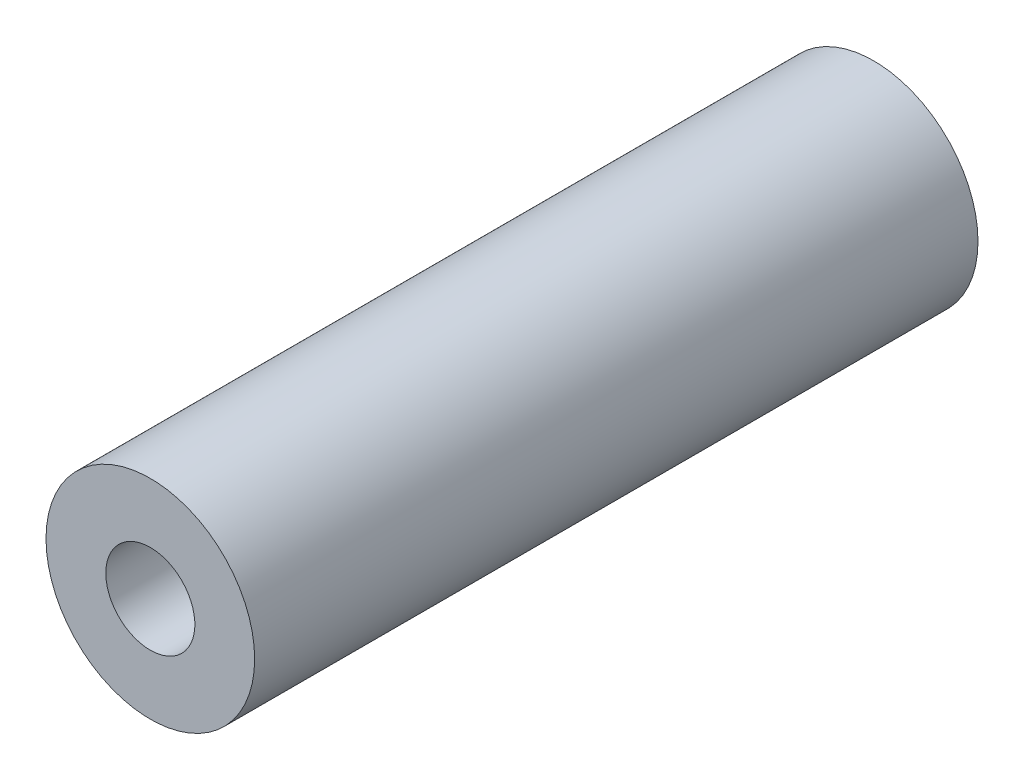
ISO-10303-21;
HEADER;
FILE_DESCRIPTION(('STEP AP214'),'2;1');
FILE_NAME('part.step','',(''),(''),'','','');
FILE_SCHEMA(('AUTOMOTIVE_DESIGN { 1 0 10303 214 1 1 1 1 }'));
ENDSEC;
DATA;
#1=APPLICATION_CONTEXT('core data for automotive mechanical design processes');
#2=APPLICATION_PROTOCOL_DEFINITION('international standard','automotive_design',2000,#1);
#3=PRODUCT_CONTEXT('',#1,'mechanical');
#4=PRODUCT('Part','Part','',(#3));
#5=PRODUCT_RELATED_PRODUCT_CATEGORY('part','',(#4));
#6=PRODUCT_DEFINITION_FORMATION('','',#4);
#7=PRODUCT_DEFINITION_CONTEXT('part definition',#1,'design');
#8=PRODUCT_DEFINITION('design','',#6,#7);
#9=PRODUCT_DEFINITION_SHAPE('','',#8);
#10=(LENGTH_UNIT() NAMED_UNIT(*) SI_UNIT(.MILLI.,.METRE.));
#11=(NAMED_UNIT(*) PLANE_ANGLE_UNIT() SI_UNIT($,.RADIAN.));
#12=(NAMED_UNIT(*) SI_UNIT($,.STERADIAN.) SOLID_ANGLE_UNIT());
#13=UNCERTAINTY_MEASURE_WITH_UNIT(LENGTH_MEASURE(1.E-05),#10,'distance_accuracy_value','');
#14=(GEOMETRIC_REPRESENTATION_CONTEXT(3) GLOBAL_UNCERTAINTY_ASSIGNED_CONTEXT((#13)) GLOBAL_UNIT_ASSIGNED_CONTEXT((#10,
#11,#12)) REPRESENTATION_CONTEXT('',''));
#15=CARTESIAN_POINT('',(0.,0.,0.));
#16=DIRECTION('',(0.,0.,1.));
#17=DIRECTION('',(1.,0.,0.));
#18=AXIS2_PLACEMENT_3D('',#15,#16,#17);
#19=CARTESIAN_POINT('',(0.,0.,26.));
#20=DIRECTION('',(0.,0.,1.));
#21=DIRECTION('',(1.,0.,0.));
#22=AXIS2_PLACEMENT_3D('',#19,#20,#21);
#23=PLANE('',#22);
#24=CARTESIAN_POINT('',(0.,0.,26.));
#25=DIRECTION('',(0.,0.,1.));
#26=DIRECTION('',(1.,0.,0.));
#27=AXIS2_PLACEMENT_3D('',#24,#25,#26);
#28=CIRCLE('',#27,3.75);
#29=CARTESIAN_POINT('',(-3.75,0.,26.));
#30=VERTEX_POINT('',#29);
#31=EDGE_CURVE('E11',#30,#30,#28,.T.);
#32=ORIENTED_EDGE('',*,*,#31,.T.);
#33=EDGE_LOOP('',(#32));
#34=FACE_BOUND('',#33,.T.);
#35=CARTESIAN_POINT('',(0.,0.,26.));
#36=DIRECTION('',(0.,0.,1.));
#37=DIRECTION('',(1.,0.,0.));
#38=AXIS2_PLACEMENT_3D('',#35,#36,#37);
#39=CIRCLE('',#38,1.6);
#40=CARTESIAN_POINT('',(-1.6,0.,26.));
#41=VERTEX_POINT('',#40);
#42=EDGE_CURVE('E48',#41,#41,#39,.T.);
#43=ORIENTED_EDGE('',*,*,#42,.F.);
#44=EDGE_LOOP('',(#43));
#45=FACE_BOUND('',#44,.T.);
#46=ADVANCED_FACE('F37',(#34,#45),#23,.T.);
#47=CARTESIAN_POINT('',(0.,0.,0.));
#48=DIRECTION('',(0.,0.,1.));
#49=DIRECTION('',(1.,0.,0.));
#50=AXIS2_PLACEMENT_3D('',#47,#48,#49);
#51=PLANE('',#50);
#52=CARTESIAN_POINT('',(0.,0.,0.));
#53=DIRECTION('',(0.,0.,1.));
#54=DIRECTION('',(1.,0.,0.));
#55=AXIS2_PLACEMENT_3D('',#52,#53,#54);
#56=CIRCLE('',#55,3.75);
#57=CARTESIAN_POINT('',(-3.75,0.,0.));
#58=VERTEX_POINT('',#57);
#59=EDGE_CURVE('E41',#58,#58,#56,.T.);
#60=ORIENTED_EDGE('',*,*,#59,.F.);
#61=EDGE_LOOP('',(#60));
#62=FACE_BOUND('',#61,.T.);
#63=CARTESIAN_POINT('',(0.,0.,0.));
#64=DIRECTION('',(0.,0.,1.));
#65=DIRECTION('',(1.,0.,0.));
#66=AXIS2_PLACEMENT_3D('',#63,#64,#65);
#67=CIRCLE('',#66,1.6);
#68=CARTESIAN_POINT('',(-1.6,0.,0.));
#69=VERTEX_POINT('',#68);
#70=EDGE_CURVE('E50',#69,#69,#67,.T.);
#71=ORIENTED_EDGE('',*,*,#70,.T.);
#72=EDGE_LOOP('',(#71));
#73=FACE_BOUND('',#72,.T.);
#74=ADVANCED_FACE('F60',(#62,#73),#51,.F.);
#75=CARTESIAN_POINT('',(0.,0.,26.));
#76=DIRECTION('',(0.,0.,-1.));
#77=DIRECTION('',(-1.,0.,0.));
#78=AXIS2_PLACEMENT_3D('',#75,#76,#77);
#79=CYLINDRICAL_SURFACE('',#78,3.75);
#80=CARTESIAN_POINT('',(-3.75,0.,26.));
#81=CARTESIAN_POINT('',(-3.75,0.,25.7291666666667));
#82=CARTESIAN_POINT('',(-3.75,0.,25.4583333333333));
#83=CARTESIAN_POINT('',(-3.75,0.,24.9166666666667));
#84=CARTESIAN_POINT('',(-3.75,0.,24.6458333333333));
#85=CARTESIAN_POINT('',(-3.75,0.,24.1041666666667));
#86=CARTESIAN_POINT('',(-3.75,0.,23.8333333333333));
#87=CARTESIAN_POINT('',(-3.75,0.,23.2916666666667));
#88=CARTESIAN_POINT('',(-3.75,0.,23.0208333333333));
#89=CARTESIAN_POINT('',(-3.75,0.,22.4791666666667));
#90=CARTESIAN_POINT('',(-3.75,0.,22.2083333333333));
#91=CARTESIAN_POINT('',(-3.75,0.,21.6666666666667));
#92=CARTESIAN_POINT('',(-3.75,0.,21.3958333333333));
#93=CARTESIAN_POINT('',(-3.75,0.,20.8541666666667));
#94=CARTESIAN_POINT('',(-3.75,0.,20.5833333333333));
#95=CARTESIAN_POINT('',(-3.75,0.,20.0416666666667));
#96=CARTESIAN_POINT('',(-3.75,0.,19.7708333333333));
#97=CARTESIAN_POINT('',(-3.75,0.,19.2291666666667));
#98=CARTESIAN_POINT('',(-3.75,0.,18.9583333333333));
#99=CARTESIAN_POINT('',(-3.75,0.,18.4166666666667));
#100=CARTESIAN_POINT('',(-3.75,0.,18.1458333333333));
#101=CARTESIAN_POINT('',(-3.75,0.,17.6041666666667));
#102=CARTESIAN_POINT('',(-3.75,0.,17.3333333333333));
#103=CARTESIAN_POINT('',(-3.75,0.,16.7916666666667));
#104=CARTESIAN_POINT('',(-3.75,0.,16.5208333333333));
#105=CARTESIAN_POINT('',(-3.75,0.,15.9791666666667));
#106=CARTESIAN_POINT('',(-3.75,0.,15.7083333333333));
#107=CARTESIAN_POINT('',(-3.75,0.,15.1666666666667));
#108=CARTESIAN_POINT('',(-3.75,0.,14.8958333333333));
#109=CARTESIAN_POINT('',(-3.75,0.,14.3541666666667));
#110=CARTESIAN_POINT('',(-3.75,0.,14.0833333333333));
#111=CARTESIAN_POINT('',(-3.75,0.,13.5416666666667));
#112=CARTESIAN_POINT('',(-3.75,0.,13.2708333333333));
#113=CARTESIAN_POINT('',(-3.75,0.,12.7291666666667));
#114=CARTESIAN_POINT('',(-3.75,0.,12.4583333333333));
#115=CARTESIAN_POINT('',(-3.75,0.,11.9166666666667));
#116=CARTESIAN_POINT('',(-3.75,0.,11.6458333333333));
#117=CARTESIAN_POINT('',(-3.75,0.,11.1041666666667));
#118=CARTESIAN_POINT('',(-3.75,0.,10.8333333333333));
#119=CARTESIAN_POINT('',(-3.75,0.,10.2916666666667));
#120=CARTESIAN_POINT('',(-3.75,0.,10.0208333333333));
#121=CARTESIAN_POINT('',(-3.75,0.,9.47916666666667));
#122=CARTESIAN_POINT('',(-3.75,0.,9.20833333333333));
#123=CARTESIAN_POINT('',(-3.75,0.,8.66666666666667));
#124=CARTESIAN_POINT('',(-3.75,0.,8.39583333333333));
#125=CARTESIAN_POINT('',(-3.75,0.,7.85416666666667));
#126=CARTESIAN_POINT('',(-3.75,0.,7.58333333333333));
#127=CARTESIAN_POINT('',(-3.75,0.,7.04166666666667));
#128=CARTESIAN_POINT('',(-3.75,0.,6.77083333333333));
#129=CARTESIAN_POINT('',(-3.75,0.,6.22916666666667));
#130=CARTESIAN_POINT('',(-3.75,0.,5.95833333333333));
#131=CARTESIAN_POINT('',(-3.75,0.,5.41666666666667));
#132=CARTESIAN_POINT('',(-3.75,0.,5.14583333333333));
#133=CARTESIAN_POINT('',(-3.75,0.,4.60416666666667));
#134=CARTESIAN_POINT('',(-3.75,0.,4.33333333333333));
#135=CARTESIAN_POINT('',(-3.75,0.,3.79166666666667));
#136=CARTESIAN_POINT('',(-3.75,0.,3.52083333333333));
#137=CARTESIAN_POINT('',(-3.75,0.,2.97916666666667));
#138=CARTESIAN_POINT('',(-3.75,0.,2.70833333333333));
#139=CARTESIAN_POINT('',(-3.75,0.,2.16666666666667));
#140=CARTESIAN_POINT('',(-3.75,0.,1.89583333333333));
#141=CARTESIAN_POINT('',(-3.75,0.,1.35416666666667));
#142=CARTESIAN_POINT('',(-3.75,0.,1.08333333333333));
#143=CARTESIAN_POINT('',(-3.75,0.,0.541666666666667));
#144=CARTESIAN_POINT('',(-3.75,0.,0.270833333333334));
#145=CARTESIAN_POINT('',(-3.75,0.,0.));
#146=B_SPLINE_CURVE_WITH_KNOTS('',3,(#80,#81,#82,#83,#84,#85,#86,#87,#88,#89,#90,#91,#92,#93,
#94,#95,#96,#97,#98,#99,#100,#101,#102,#103,#104,#105,#106,#107,#108,#109,#110,#111,#112,#113,
#114,#115,#116,#117,#118,#119,#120,#121,#122,#123,#124,#125,#126,#127,#128,#129,#130,#131,#132,
#133,#134,#135,#136,#137,#138,#139,#140,#141,#142,#143,#144,#145),.UNSPECIFIED.,.F.,.F.,(4,2,2,
2,2,2,2,2,2,2,2,2,2,2,2,2,2,2,2,2,2,2,2,2,2,2,2,2,2,2,2,2,4),(0.,0.812500000000001,1.625,2.4375,
3.25,4.0625,4.875,5.6875,6.5,7.3125,8.125,8.9375,9.75,10.5625,11.375,12.1875,13.,13.8125,14.625,
15.4375,16.25,17.0625,17.875,18.6875,19.5,20.3125,21.125,21.9375,22.75,23.5625,24.375,25.1875,
26.),.UNSPECIFIED.);
#147=EDGE_CURVE('BSEAM39',#30,#58,#146,.T.);
#148=ORIENTED_EDGE('',*,*,#31,.F.);
#149=ORIENTED_EDGE('',*,*,#59,.T.);
#150=ORIENTED_EDGE('',*,*,#147,.T.);
#151=ORIENTED_EDGE('',*,*,#147,.F.);
#152=EDGE_LOOP('',(#148,#150,#149,#151));
#153=FACE_BOUND('',#152,.T.);
#154=ADVANCED_FACE('F39',(#153),#79,.T.);
#155=CARTESIAN_POINT('',(0.,0.,26.));
#156=DIRECTION('',(0.,0.,-1.));
#157=DIRECTION('',(-1.,0.,0.));
#158=AXIS2_PLACEMENT_3D('',#155,#156,#157);
#159=CYLINDRICAL_SURFACE('',#158,1.6);
#160=CARTESIAN_POINT('',(-1.6,0.,26.));
#161=CARTESIAN_POINT('',(-1.6,0.,25.7291666666667));
#162=CARTESIAN_POINT('',(-1.6,0.,25.4583333333333));
#163=CARTESIAN_POINT('',(-1.6,0.,24.9166666666667));
#164=CARTESIAN_POINT('',(-1.6,0.,24.6458333333333));
#165=CARTESIAN_POINT('',(-1.6,0.,24.1041666666667));
#166=CARTESIAN_POINT('',(-1.6,0.,23.8333333333333));
#167=CARTESIAN_POINT('',(-1.6,0.,23.2916666666667));
#168=CARTESIAN_POINT('',(-1.6,0.,23.0208333333333));
#169=CARTESIAN_POINT('',(-1.6,0.,22.4791666666667));
#170=CARTESIAN_POINT('',(-1.6,0.,22.2083333333333));
#171=CARTESIAN_POINT('',(-1.6,0.,21.6666666666667));
#172=CARTESIAN_POINT('',(-1.6,0.,21.3958333333333));
#173=CARTESIAN_POINT('',(-1.6,0.,20.8541666666667));
#174=CARTESIAN_POINT('',(-1.6,0.,20.5833333333333));
#175=CARTESIAN_POINT('',(-1.6,0.,20.0416666666667));
#176=CARTESIAN_POINT('',(-1.6,0.,19.7708333333333));
#177=CARTESIAN_POINT('',(-1.6,0.,19.2291666666667));
#178=CARTESIAN_POINT('',(-1.6,0.,18.9583333333333));
#179=CARTESIAN_POINT('',(-1.6,0.,18.4166666666667));
#180=CARTESIAN_POINT('',(-1.6,0.,18.1458333333333));
#181=CARTESIAN_POINT('',(-1.6,0.,17.6041666666667));
#182=CARTESIAN_POINT('',(-1.6,0.,17.3333333333333));
#183=CARTESIAN_POINT('',(-1.6,0.,16.7916666666667));
#184=CARTESIAN_POINT('',(-1.6,0.,16.5208333333333));
#185=CARTESIAN_POINT('',(-1.6,0.,15.9791666666667));
#186=CARTESIAN_POINT('',(-1.6,0.,15.7083333333333));
#187=CARTESIAN_POINT('',(-1.6,0.,15.1666666666667));
#188=CARTESIAN_POINT('',(-1.6,0.,14.8958333333333));
#189=CARTESIAN_POINT('',(-1.6,0.,14.3541666666667));
#190=CARTESIAN_POINT('',(-1.6,0.,14.0833333333333));
#191=CARTESIAN_POINT('',(-1.6,0.,13.5416666666667));
#192=CARTESIAN_POINT('',(-1.6,0.,13.2708333333333));
#193=CARTESIAN_POINT('',(-1.6,0.,12.7291666666667));
#194=CARTESIAN_POINT('',(-1.6,0.,12.4583333333333));
#195=CARTESIAN_POINT('',(-1.6,0.,11.9166666666667));
#196=CARTESIAN_POINT('',(-1.6,0.,11.6458333333333));
#197=CARTESIAN_POINT('',(-1.6,0.,11.1041666666667));
#198=CARTESIAN_POINT('',(-1.6,0.,10.8333333333333));
#199=CARTESIAN_POINT('',(-1.6,0.,10.2916666666667));
#200=CARTESIAN_POINT('',(-1.6,0.,10.0208333333333));
#201=CARTESIAN_POINT('',(-1.6,0.,9.47916666666667));
#202=CARTESIAN_POINT('',(-1.6,0.,9.20833333333333));
#203=CARTESIAN_POINT('',(-1.6,0.,8.66666666666667));
#204=CARTESIAN_POINT('',(-1.6,0.,8.39583333333333));
#205=CARTESIAN_POINT('',(-1.6,0.,7.85416666666667));
#206=CARTESIAN_POINT('',(-1.6,0.,7.58333333333333));
#207=CARTESIAN_POINT('',(-1.6,0.,7.04166666666667));
#208=CARTESIAN_POINT('',(-1.6,0.,6.77083333333333));
#209=CARTESIAN_POINT('',(-1.6,0.,6.22916666666667));
#210=CARTESIAN_POINT('',(-1.6,0.,5.95833333333333));
#211=CARTESIAN_POINT('',(-1.6,0.,5.41666666666667));
#212=CARTESIAN_POINT('',(-1.6,0.,5.14583333333333));
#213=CARTESIAN_POINT('',(-1.6,0.,4.60416666666667));
#214=CARTESIAN_POINT('',(-1.6,0.,4.33333333333333));
#215=CARTESIAN_POINT('',(-1.6,0.,3.79166666666667));
#216=CARTESIAN_POINT('',(-1.6,0.,3.52083333333333));
#217=CARTESIAN_POINT('',(-1.6,0.,2.97916666666667));
#218=CARTESIAN_POINT('',(-1.6,0.,2.70833333333333));
#219=CARTESIAN_POINT('',(-1.6,0.,2.16666666666667));
#220=CARTESIAN_POINT('',(-1.6,0.,1.89583333333333));
#221=CARTESIAN_POINT('',(-1.6,0.,1.35416666666667));
#222=CARTESIAN_POINT('',(-1.6,0.,1.08333333333333));
#223=CARTESIAN_POINT('',(-1.6,0.,0.541666666666667));
#224=CARTESIAN_POINT('',(-1.6,0.,0.270833333333334));
#225=CARTESIAN_POINT('',(-1.6,0.,0.));
#226=B_SPLINE_CURVE_WITH_KNOTS('',3,(#160,#161,#162,#163,#164,#165,#166,#167,#168,#169,#170,
#171,#172,#173,#174,#175,#176,#177,#178,#179,#180,#181,#182,#183,#184,#185,#186,#187,#188,#189,
#190,#191,#192,#193,#194,#195,#196,#197,#198,#199,#200,#201,#202,#203,#204,#205,#206,#207,#208,
#209,#210,#211,#212,#213,#214,#215,#216,#217,#218,#219,#220,#221,#222,#223,#224,#225),
.UNSPECIFIED.,.F.,.F.,(4,2,2,2,2,2,2,2,2,2,2,2,2,2,2,2,2,2,2,2,2,2,2,2,2,2,2,2,2,2,2,2,4),(0.,
0.812500000000001,1.625,2.4375,3.25,4.0625,4.875,5.6875,6.5,7.3125,8.125,8.9375,9.75,10.5625,
11.375,12.1875,13.,13.8125,14.625,15.4375,16.25,17.0625,17.875,18.6875,19.5,20.3125,21.125,
21.9375,22.75,23.5625,24.375,25.1875,26.),.UNSPECIFIED.);
#227=EDGE_CURVE('BSEAM56',#41,#69,#226,.T.);
#228=ORIENTED_EDGE('',*,*,#42,.T.);
#229=ORIENTED_EDGE('',*,*,#70,.F.);
#230=ORIENTED_EDGE('',*,*,#227,.T.);
#231=ORIENTED_EDGE('',*,*,#227,.F.);
#232=EDGE_LOOP('',(#228,#230,#229,#231));
#233=FACE_BOUND('',#232,.T.);
#234=ADVANCED_FACE('F56',(#233),#159,.F.);
#235=CLOSED_SHELL('',(#46,#74,#154,#234));
#236=MANIFOLD_SOLID_BREP('B2',#235);
#237=ADVANCED_BREP_SHAPE_REPRESENTATION('',(#18,#236),#14);
#238=SHAPE_DEFINITION_REPRESENTATION(#9,#237);
ENDSEC;
END-ISO-10303-21;
